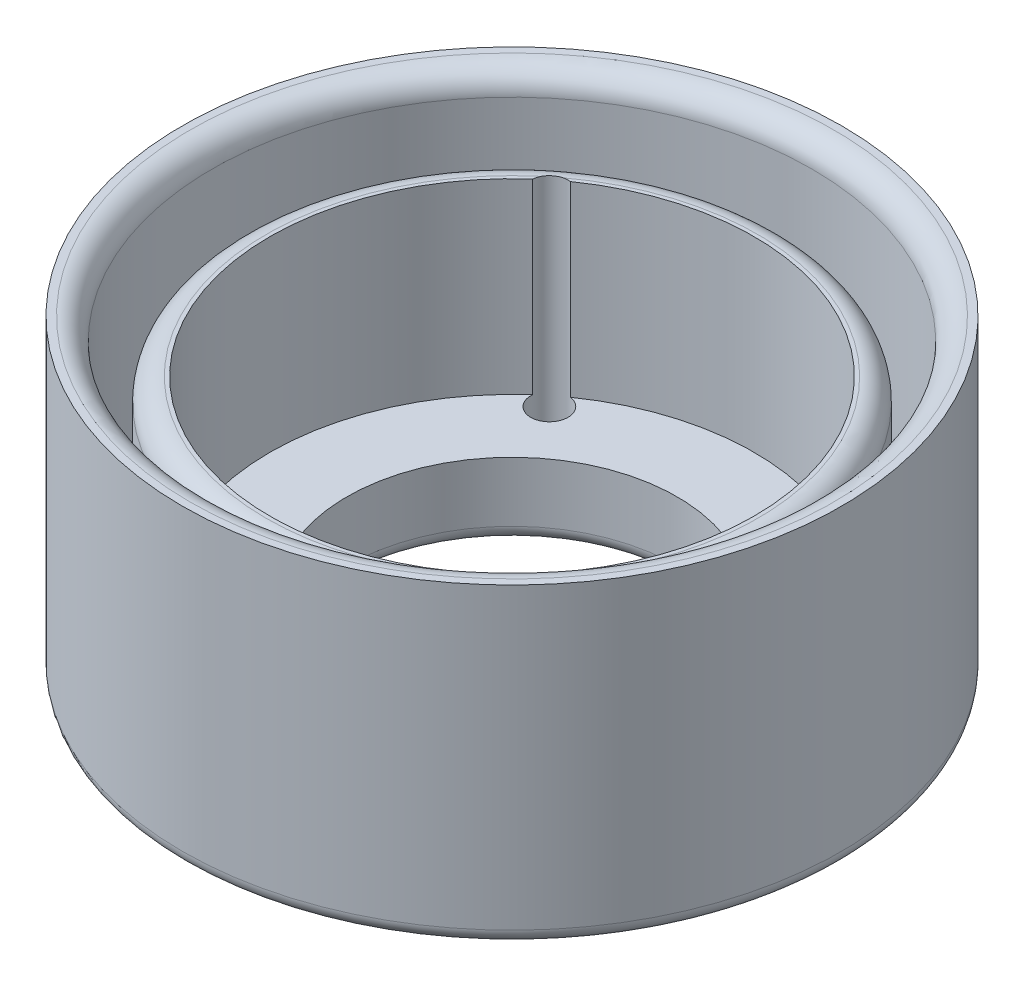
ISO-10303-21;
HEADER;
FILE_DESCRIPTION(('STEP AP214'),'2;1');
FILE_NAME('part.step','',(''),(''),'','','');
FILE_SCHEMA(('AUTOMOTIVE_DESIGN { 1 0 10303 214 1 1 1 1 }'));
ENDSEC;
DATA;
#1=APPLICATION_CONTEXT('core data for automotive mechanical design processes');
#2=APPLICATION_PROTOCOL_DEFINITION('international standard','automotive_design',2000,#1);
#3=PRODUCT_CONTEXT('',#1,'mechanical');
#4=PRODUCT('Part','Part','',(#3));
#5=PRODUCT_RELATED_PRODUCT_CATEGORY('part','',(#4));
#6=PRODUCT_DEFINITION_FORMATION('','',#4);
#7=PRODUCT_DEFINITION_CONTEXT('part definition',#1,'design');
#8=PRODUCT_DEFINITION('design','',#6,#7);
#9=PRODUCT_DEFINITION_SHAPE('','',#8);
#10=(LENGTH_UNIT() NAMED_UNIT(*) SI_UNIT(.MILLI.,.METRE.));
#11=(NAMED_UNIT(*) PLANE_ANGLE_UNIT() SI_UNIT($,.RADIAN.));
#12=(NAMED_UNIT(*) SI_UNIT($,.STERADIAN.) SOLID_ANGLE_UNIT());
#13=UNCERTAINTY_MEASURE_WITH_UNIT(LENGTH_MEASURE(1.E-05),#10,'distance_accuracy_value','');
#14=(GEOMETRIC_REPRESENTATION_CONTEXT(3) GLOBAL_UNCERTAINTY_ASSIGNED_CONTEXT((#13)) GLOBAL_UNIT_ASSIGNED_CONTEXT((#10,
#11,#12)) REPRESENTATION_CONTEXT('',''));
#15=CARTESIAN_POINT('',(0.,0.,0.));
#16=DIRECTION('',(0.,0.,1.));
#17=DIRECTION('',(1.,0.,0.));
#18=AXIS2_PLACEMENT_3D('',#15,#16,#17);
#19=CARTESIAN_POINT('',(0.,12.5,0.));
#20=DIRECTION('',(0.,1.,0.));
#21=DIRECTION('',(0.,0.,1.));
#22=AXIS2_PLACEMENT_3D('',#19,#20,#21);
#23=PLANE('',#22);
#24=CARTESIAN_POINT('',(-9.5,12.5,-12.));
#25=DIRECTION('',(0.,1.,0.));
#26=DIRECTION('',(0.,0.,1.));
#27=AXIS2_PLACEMENT_3D('',#24,#25,#26);
#28=CIRCLE('',#27,1.25);
#29=CARTESIAN_POINT('',(-10.743749989338,12.5,-12.1248437584407));
#30=VERTEX_POINT('',#29);
#31=CARTESIAN_POINT('',(-10.6134418037851,12.5,-12.5681085720035));
#32=VERTEX_POINT('',#31);
#33=EDGE_CURVE('E208',#30,#32,#28,.F.);
#34=ORIENTED_EDGE('',*,*,#33,.T.);
#35=CARTESIAN_POINT('',(0.,12.5,0.));
#36=DIRECTION('',(0.,1.,0.));
#37=DIRECTION('',(0.,0.,1.));
#38=AXIS2_PLACEMENT_3D('',#35,#36,#37);
#39=CIRCLE('',#38,16.45);
#40=CARTESIAN_POINT('',(9.79746534669518,12.5,13.2140899338663));
#41=VERTEX_POINT('',#40);
#42=EDGE_CURVE('E133',#32,#41,#39,.T.);
#43=ORIENTED_EDGE('',*,*,#42,.T.);
#44=CARTESIAN_POINT('',(9.50000000000001,12.5,12.));
#45=DIRECTION('',(0.,1.,0.));
#46=DIRECTION('',(0.,0.,1.));
#47=AXIS2_PLACEMENT_3D('',#44,#45,#46);
#48=CIRCLE('',#47,1.25);
#49=CARTESIAN_POINT('',(9.33612727853819,12.5,13.2392117378239));
#50=VERTEX_POINT('',#49);
#51=EDGE_CURVE('E252',#41,#50,#48,.F.);
#52=ORIENTED_EDGE('',*,*,#51,.T.);
#53=CARTESIAN_POINT('',(0.,12.5,0.));
#54=DIRECTION('',(0.,1.,0.));
#55=DIRECTION('',(0.,0.,1.));
#56=AXIS2_PLACEMENT_3D('',#53,#54,#55);
#57=CIRCLE('',#56,16.2);
#58=EDGE_CURVE('E210',#30,#50,#57,.T.);
#59=ORIENTED_EDGE('',*,*,#58,.F.);
#60=EDGE_LOOP('',(#34,#43,#52,#59));
#61=FACE_BOUND('',#60,.T.);
#62=ADVANCED_FACE('F37',(#61),#23,.T.);
#63=CARTESIAN_POINT('',(0.,12.5,0.));
#64=DIRECTION('',(0.,-1.,0.));
#65=DIRECTION('',(0.,0.,-1.));
#66=AXIS2_PLACEMENT_3D('',#63,#64,#65);
#67=CYLINDRICAL_SURFACE('',#66,16.2);
#68=DIRECTION('',(0.,-1.,0.));
#69=VECTOR('',#68,1.);
#70=CARTESIAN_POINT('',(-9.33612727853814,6.25,-13.239211737824));
#71=LINE('',#70,#69);
#72=CARTESIAN_POINT('',(-9.33612727853818,12.5,-13.2392117378239));
#73=VERTEX_POINT('',#72);
#74=CARTESIAN_POINT('',(-9.33612727853818,0.,-13.2392117378239));
#75=VERTEX_POINT('',#74);
#76=EDGE_CURVE('E95',#73,#75,#71,.T.);
#77=ORIENTED_EDGE('',*,*,#76,.T.);
#78=CARTESIAN_POINT('',(0.,0.,0.));
#79=DIRECTION('',(0.,1.,0.));
#80=DIRECTION('',(0.,0.,1.));
#81=AXIS2_PLACEMENT_3D('',#78,#79,#80);
#82=CIRCLE('',#81,16.2);
#83=CARTESIAN_POINT('',(10.743749989338,0.,12.1248437584407));
#84=VERTEX_POINT('',#83);
#85=EDGE_CURVE('E108',#75,#84,#82,.F.);
#86=ORIENTED_EDGE('',*,*,#85,.T.);
#87=DIRECTION('',(0.,-1.,0.));
#88=VECTOR('',#87,1.);
#89=CARTESIAN_POINT('',(10.7437499893381,6.25,12.1248437584407));
#90=LINE('',#89,#88);
#91=CARTESIAN_POINT('',(10.743749989338,12.5,12.1248437584407));
#92=VERTEX_POINT('',#91);
#93=EDGE_CURVE('E250',#84,#92,#90,.F.);
#94=ORIENTED_EDGE('',*,*,#93,.T.);
#95=EDGE_CURVE('E111',#92,#73,#57,.T.);
#96=ORIENTED_EDGE('',*,*,#95,.T.);
#97=EDGE_LOOP('',(#77,#86,#94,#96));
#98=FACE_BOUND('',#97,.T.);
#99=ADVANCED_FACE('F106',(#98),#67,.F.);
#100=CARTESIAN_POINT('',(0.,16.,0.));
#101=DIRECTION('',(0.,-1.,0.));
#102=DIRECTION('',(0.,0.,-1.));
#103=AXIS2_PLACEMENT_3D('',#100,#101,#102);
#104=CYLINDRICAL_SURFACE('',#103,20.05);
#105=CARTESIAN_POINT('',(0.,14.5,0.));
#106=DIRECTION('',(0.,1.,0.));
#107=DIRECTION('',(0.,0.,1.));
#108=AXIS2_PLACEMENT_3D('',#105,#106,#107);
#109=CIRCLE('',#108,20.05);
#110=CARTESIAN_POINT('',(0.,14.5,20.05));
#111=VERTEX_POINT('',#110);
#112=EDGE_CURVE('E217',#111,#111,#109,.T.);
#113=ORIENTED_EDGE('',*,*,#112,.T.);
#114=EDGE_LOOP('',(#113));
#115=FACE_BOUND('',#114,.T.);
#116=CARTESIAN_POINT('',(0.,0.,0.));
#117=DIRECTION('',(0.,1.,0.));
#118=DIRECTION('',(0.,0.,1.));
#119=AXIS2_PLACEMENT_3D('',#116,#117,#118);
#120=CIRCLE('',#119,20.05);
#121=CARTESIAN_POINT('',(0.,0.,20.05));
#122=VERTEX_POINT('',#121);
#123=EDGE_CURVE('E122',#122,#122,#120,.T.);
#124=ORIENTED_EDGE('',*,*,#123,.F.);
#125=EDGE_LOOP('',(#124));
#126=FACE_BOUND('',#125,.T.);
#127=ADVANCED_FACE('F186',(#115,#126),#104,.F.);
#128=CARTESIAN_POINT('',(0.,16.,0.));
#129=DIRECTION('',(0.,-1.,0.));
#130=DIRECTION('',(0.,0.,-1.));
#131=AXIS2_PLACEMENT_3D('',#128,#129,#130);
#132=CYLINDRICAL_SURFACE('',#131,22.05);
#133=CARTESIAN_POINT('',(0.,-4.,0.));
#134=DIRECTION('',(0.,1.,0.));
#135=DIRECTION('',(0.,0.,1.));
#136=AXIS2_PLACEMENT_3D('',#133,#134,#135);
#137=CIRCLE('',#136,22.05);
#138=CARTESIAN_POINT('',(0.,-4.,22.05));
#139=VERTEX_POINT('',#138);
#140=EDGE_CURVE('E45',#139,#139,#137,.T.);
#141=ORIENTED_EDGE('',*,*,#140,.T.);
#142=EDGE_LOOP('',(#141));
#143=FACE_BOUND('',#142,.T.);
#144=CARTESIAN_POINT('',(0.,16.,0.));
#145=DIRECTION('',(0.,1.,0.));
#146=DIRECTION('',(0.,0.,1.));
#147=AXIS2_PLACEMENT_3D('',#144,#145,#146);
#148=CIRCLE('',#147,22.05);
#149=CARTESIAN_POINT('',(0.,16.,22.05));
#150=VERTEX_POINT('',#149);
#151=EDGE_CURVE('E118',#150,#150,#148,.T.);
#152=ORIENTED_EDGE('',*,*,#151,.F.);
#153=EDGE_LOOP('',(#152));
#154=FACE_BOUND('',#153,.T.);
#155=ADVANCED_FACE('F182',(#143,#154),#132,.T.);
#156=CARTESIAN_POINT('',(0.,16.,0.));
#157=DIRECTION('',(0.,1.,0.));
#158=DIRECTION('',(0.,0.,1.));
#159=AXIS2_PLACEMENT_3D('',#156,#157,#158);
#160=PLANE('',#159);
#161=CARTESIAN_POINT('',(0.,16.,0.));
#162=DIRECTION('',(0.,1.,0.));
#163=DIRECTION('',(0.,0.,1.));
#164=AXIS2_PLACEMENT_3D('',#161,#162,#163);
#165=CIRCLE('',#164,21.55);
#166=CARTESIAN_POINT('',(0.,16.,21.55));
#167=VERTEX_POINT('',#166);
#168=EDGE_CURVE('E220',#167,#167,#165,.F.);
#169=ORIENTED_EDGE('',*,*,#168,.T.);
#170=EDGE_LOOP('',(#169));
#171=FACE_BOUND('',#170,.T.);
#172=ORIENTED_EDGE('',*,*,#151,.T.);
#173=EDGE_LOOP('',(#172));
#174=FACE_BOUND('',#173,.T.);
#175=ADVANCED_FACE('F175',(#171,#174),#160,.T.);
#176=CARTESIAN_POINT('',(0.,-5.,0.));
#177=DIRECTION('',(0.,1.,0.));
#178=DIRECTION('',(0.,0.,1.));
#179=AXIS2_PLACEMENT_3D('',#176,#177,#178);
#180=PLANE('',#179);
#181=CARTESIAN_POINT('',(0.,-5.,0.));
#182=DIRECTION('',(0.,1.,0.));
#183=DIRECTION('',(0.,0.,1.));
#184=AXIS2_PLACEMENT_3D('',#181,#182,#183);
#185=CIRCLE('',#184,21.05);
#186=CARTESIAN_POINT('',(0.,-5.,21.05));
#187=VERTEX_POINT('',#186);
#188=EDGE_CURVE('E11',#187,#187,#185,.F.);
#189=ORIENTED_EDGE('',*,*,#188,.T.);
#190=EDGE_LOOP('',(#189));
#191=FACE_BOUND('',#190,.T.);
#192=CARTESIAN_POINT('',(0.,-5.,0.));
#193=DIRECTION('',(0.,1.,0.));
#194=DIRECTION('',(0.,0.,1.));
#195=AXIS2_PLACEMENT_3D('',#192,#193,#194);
#196=CIRCLE('',#195,12.05);
#197=CARTESIAN_POINT('',(0.,-5.,12.05));
#198=VERTEX_POINT('',#197);
#199=EDGE_CURVE('E128',#198,#198,#196,.T.);
#200=ORIENTED_EDGE('',*,*,#199,.T.);
#201=EDGE_LOOP('',(#200));
#202=FACE_BOUND('',#201,.T.);
#203=CARTESIAN_POINT('',(-9.5,-5.,-12.));
#204=DIRECTION('',(0.,-1.,0.));
#205=DIRECTION('',(0.,0.,-1.));
#206=AXIS2_PLACEMENT_3D('',#203,#204,#205);
#207=CIRCLE('',#206,1.25);
#208=CARTESIAN_POINT('',(-9.5,-5.,-13.25));
#209=VERTEX_POINT('',#208);
#210=EDGE_CURVE('E103',#209,#209,#207,.T.);
#211=ORIENTED_EDGE('',*,*,#210,.F.);
#212=EDGE_LOOP('',(#211));
#213=FACE_BOUND('',#212,.T.);
#214=CARTESIAN_POINT('',(9.50000000000001,-5.,12.));
#215=DIRECTION('',(0.,-1.,0.));
#216=DIRECTION('',(0.,0.,-1.));
#217=AXIS2_PLACEMENT_3D('',#214,#215,#216);
#218=CIRCLE('',#217,1.25);
#219=CARTESIAN_POINT('',(9.50000000000001,-5.,10.75));
#220=VERTEX_POINT('',#219);
#221=EDGE_CURVE('E211',#220,#220,#218,.T.);
#222=ORIENTED_EDGE('',*,*,#221,.F.);
#223=EDGE_LOOP('',(#222));
#224=FACE_BOUND('',#223,.T.);
#225=ADVANCED_FACE('F172',(#191,#202,#213,#224),#180,.F.);
#226=CARTESIAN_POINT('',(0.,0.,0.));
#227=DIRECTION('',(0.,1.,0.));
#228=DIRECTION('',(0.,0.,1.));
#229=AXIS2_PLACEMENT_3D('',#226,#227,#228);
#230=PLANE('',#229);
#231=CARTESIAN_POINT('',(0.,0.,0.));
#232=DIRECTION('',(0.,1.,0.));
#233=DIRECTION('',(0.,0.,1.));
#234=AXIS2_PLACEMENT_3D('',#231,#232,#233);
#235=CIRCLE('',#234,17.95);
#236=CARTESIAN_POINT('',(0.,0.,17.95));
#237=VERTEX_POINT('',#236);
#238=EDGE_CURVE('E258',#237,#237,#235,.T.);
#239=ORIENTED_EDGE('',*,*,#238,.F.);
#240=EDGE_LOOP('',(#239));
#241=FACE_BOUND('',#240,.T.);
#242=ORIENTED_EDGE('',*,*,#123,.T.);
#243=EDGE_LOOP('',(#242));
#244=FACE_BOUND('',#243,.T.);
#245=ADVANCED_FACE('F170',(#241,#244),#230,.T.);
#246=DIRECTION('',(0.,-1.,0.));
#247=VECTOR('',#246,1.);
#248=CARTESIAN_POINT('',(-10.743749989338,6.25,-12.1248437584407));
#249=LINE('',#248,#247);
#250=CARTESIAN_POINT('',(-10.743749989338,0.,-12.1248437584407));
#251=VERTEX_POINT('',#250);
#252=EDGE_CURVE('E98',#251,#30,#249,.F.);
#253=ORIENTED_EDGE('',*,*,#252,.T.);
#254=ORIENTED_EDGE('',*,*,#58,.T.);
#255=DIRECTION('',(0.,-1.,0.));
#256=VECTOR('',#255,1.);
#257=CARTESIAN_POINT('',(9.33612727853816,6.25,13.239211737824));
#258=LINE('',#257,#256);
#259=CARTESIAN_POINT('',(9.33612727853819,0.,13.2392117378239));
#260=VERTEX_POINT('',#259);
#261=EDGE_CURVE('E244',#50,#260,#258,.T.);
#262=ORIENTED_EDGE('',*,*,#261,.T.);
#263=EDGE_CURVE('E117',#260,#251,#82,.F.);
#264=ORIENTED_EDGE('',*,*,#263,.T.);
#265=EDGE_LOOP('',(#253,#254,#262,#264));
#266=FACE_BOUND('',#265,.T.);
#267=ADVANCED_FACE('F166',(#266),#67,.F.);
#268=CARTESIAN_POINT('',(0.,12.5,0.));
#269=DIRECTION('',(0.,-1.,0.));
#270=DIRECTION('',(0.,0.,-1.));
#271=AXIS2_PLACEMENT_3D('',#268,#269,#270);
#272=CYLINDRICAL_SURFACE('',#271,17.95);
#273=CARTESIAN_POINT('',(0.,11.,0.));
#274=DIRECTION('',(0.,1.,0.));
#275=DIRECTION('',(0.,0.,1.));
#276=AXIS2_PLACEMENT_3D('',#273,#274,#275);
#277=CIRCLE('',#276,17.95);
#278=CARTESIAN_POINT('',(0.,11.,17.95));
#279=VERTEX_POINT('',#278);
#280=EDGE_CURVE('E215',#279,#279,#277,.F.);
#281=ORIENTED_EDGE('',*,*,#280,.T.);
#282=EDGE_LOOP('',(#281));
#283=FACE_BOUND('',#282,.T.);
#284=ORIENTED_EDGE('',*,*,#238,.T.);
#285=EDGE_LOOP('',(#284));
#286=FACE_BOUND('',#285,.T.);
#287=ADVANCED_FACE('F162',(#283,#286),#272,.T.);
#288=CARTESIAN_POINT('',(10.6134418037851,12.5,12.5681085720035));
#289=VERTEX_POINT('',#288);
#290=EDGE_CURVE('E253',#92,#289,#48,.F.);
#291=ORIENTED_EDGE('',*,*,#290,.T.);
#292=CARTESIAN_POINT('',(0.,12.5,0.));
#293=DIRECTION('',(0.,1.,0.));
#294=DIRECTION('',(0.,0.,1.));
#295=AXIS2_PLACEMENT_3D('',#292,#293,#294);
#296=CIRCLE('',#295,16.45);
#297=CARTESIAN_POINT('',(-9.79746534669517,12.5,-13.2140899338663));
#298=VERTEX_POINT('',#297);
#299=EDGE_CURVE('E131',#289,#298,#296,.T.);
#300=ORIENTED_EDGE('',*,*,#299,.T.);
#301=EDGE_CURVE('E212',#298,#73,#28,.F.);
#302=ORIENTED_EDGE('',*,*,#301,.T.);
#303=ORIENTED_EDGE('',*,*,#95,.F.);
#304=EDGE_LOOP('',(#291,#300,#302,#303));
#305=FACE_BOUND('',#304,.T.);
#306=ADVANCED_FACE('F159',(#305),#23,.T.);
#307=CARTESIAN_POINT('',(-9.5,0.,-12.));
#308=DIRECTION('',(0.,1.,0.));
#309=DIRECTION('',(0.,0.,1.));
#310=AXIS2_PLACEMENT_3D('',#307,#308,#309);
#311=CIRCLE('',#310,1.25);
#312=EDGE_CURVE('E90',#75,#251,#311,.F.);
#313=ORIENTED_EDGE('',*,*,#312,.T.);
#314=ORIENTED_EDGE('',*,*,#263,.F.);
#315=CARTESIAN_POINT('',(9.50000000000001,0.,12.));
#316=DIRECTION('',(0.,1.,0.));
#317=DIRECTION('',(0.,0.,1.));
#318=AXIS2_PLACEMENT_3D('',#315,#316,#317);
#319=CIRCLE('',#318,1.25);
#320=EDGE_CURVE('E116',#260,#84,#319,.F.);
#321=ORIENTED_EDGE('',*,*,#320,.T.);
#322=ORIENTED_EDGE('',*,*,#85,.F.);
#323=EDGE_LOOP('',(#313,#314,#321,#322));
#324=FACE_BOUND('',#323,.T.);
#325=CARTESIAN_POINT('',(0.,0.,0.));
#326=DIRECTION('',(0.,1.,0.));
#327=DIRECTION('',(0.,0.,1.));
#328=AXIS2_PLACEMENT_3D('',#325,#326,#327);
#329=CIRCLE('',#328,11.05);
#330=CARTESIAN_POINT('',(0.,0.,11.05));
#331=VERTEX_POINT('',#330);
#332=EDGE_CURVE('E255',#331,#331,#329,.F.);
#333=ORIENTED_EDGE('',*,*,#332,.T.);
#334=EDGE_LOOP('',(#333));
#335=FACE_BOUND('',#334,.T.);
#336=ADVANCED_FACE('F114',(#324,#335),#230,.T.);
#337=CARTESIAN_POINT('',(0.,16.001,0.));
#338=DIRECTION('',(0.,-1.,0.));
#339=DIRECTION('',(0.,0.,-1.));
#340=AXIS2_PLACEMENT_3D('',#337,#338,#339);
#341=CYLINDRICAL_SURFACE('',#340,11.05);
#342=CARTESIAN_POINT('',(0.,-4.,0.));
#343=DIRECTION('',(0.,1.,0.));
#344=DIRECTION('',(0.,0.,1.));
#345=AXIS2_PLACEMENT_3D('',#342,#343,#344);
#346=CIRCLE('',#345,11.05);
#347=CARTESIAN_POINT('',(0.,-4.,11.05));
#348=VERTEX_POINT('',#347);
#349=EDGE_CURVE('E120',#348,#348,#346,.F.);
#350=ORIENTED_EDGE('',*,*,#349,.T.);
#351=EDGE_LOOP('',(#350));
#352=FACE_BOUND('',#351,.T.);
#353=ORIENTED_EDGE('',*,*,#332,.F.);
#354=EDGE_LOOP('',(#353));
#355=FACE_BOUND('',#354,.T.);
#356=ADVANCED_FACE('F154',(#352,#355),#341,.F.);
#357=CARTESIAN_POINT('',(9.50000000000001,16.001,12.));
#358=DIRECTION('',(0.,-1.,0.));
#359=DIRECTION('',(0.,0.,-1.));
#360=AXIS2_PLACEMENT_3D('',#357,#358,#359);
#361=CYLINDRICAL_SURFACE('',#360,1.25);
#362=ORIENTED_EDGE('',*,*,#51,.F.);
#363=CARTESIAN_POINT('',(9.79746534669518,12.5,13.2140899338663));
#364=CARTESIAN_POINT('',(9.83159877535244,12.4999955857231,13.2057263986661));
#365=CARTESIAN_POINT('',(9.86536169705997,12.4998154547105,13.1959276805059));
#366=CARTESIAN_POINT('',(9.93194134990984,12.4992730166514,13.1735253895522));
#367=CARTESIAN_POINT('',(9.96475810783621,12.4989107147671,13.1609218962447));
#368=CARTESIAN_POINT('',(10.0614116659808,12.4978052324506,13.1190331438967));
#369=CARTESIAN_POINT('',(10.1235295251341,12.4970427032076,13.085650479651));
#370=CARTESIAN_POINT('',(10.2412962000051,12.496239685228,13.0089260305306));
#371=CARTESIAN_POINT('',(10.2969399594489,12.4961997571318,12.9655765391552));
#372=CARTESIAN_POINT('',(10.40011567983,12.4968771766773,12.8701800315109));
#373=CARTESIAN_POINT('',(10.4476576786174,12.4975935792068,12.8181439383648));
#374=CARTESIAN_POINT('',(10.5139143054173,12.498740221059,12.7320928785336));
#375=CARTESIAN_POINT('',(10.5359415851097,12.4991533324704,12.7005723574991));
#376=CARTESIAN_POINT('',(10.5769801344743,12.4997795763179,12.6356768001268));
#377=CARTESIAN_POINT('',(10.5959949867349,12.4999929478046,12.6023040314025));
#378=CARTESIAN_POINT('',(10.6134418037851,12.5,12.5681085720035));
#379=B_SPLINE_CURVE_WITH_KNOTS('',3,(#363,#364,#365,#366,#367,#368,#369,#370,#371,#372,#373,
#374,#375,#376,#377,#378),.UNSPECIFIED.,.F.,.F.,(4,2,2,2,2,2,2,4),(0.,0.10536206176478,
0.210721138001865,0.421202047950026,0.631846255506518,0.842227552906535,0.957452648632279,
1.07253966495443),.UNSPECIFIED.);
#380=EDGE_CURVE('E52',#41,#289,#379,.T.);
#381=ORIENTED_EDGE('',*,*,#380,.T.);
#382=ORIENTED_EDGE('',*,*,#290,.F.);
#383=ORIENTED_EDGE('',*,*,#93,.F.);
#384=ORIENTED_EDGE('',*,*,#320,.F.);
#385=ORIENTED_EDGE('',*,*,#261,.F.);
#386=EDGE_LOOP('',(#362,#381,#382,#383,#384,#385));
#387=FACE_BOUND('',#386,.T.);
#388=ORIENTED_EDGE('',*,*,#221,.T.);
#389=EDGE_LOOP('',(#388));
#390=FACE_BOUND('',#389,.T.);
#391=ADVANCED_FACE('F150',(#387,#390),#361,.F.);
#392=CARTESIAN_POINT('',(-9.5,16.001,-12.));
#393=DIRECTION('',(0.,-1.,0.));
#394=DIRECTION('',(0.,0.,-1.));
#395=AXIS2_PLACEMENT_3D('',#392,#393,#394);
#396=CYLINDRICAL_SURFACE('',#395,1.25);
#397=ORIENTED_EDGE('',*,*,#301,.F.);
#398=CARTESIAN_POINT('',(-9.79746534669517,12.5,-13.2140899338663));
#399=CARTESIAN_POINT('',(-9.83159877535243,12.4999955857231,-13.2057263986661));
#400=CARTESIAN_POINT('',(-9.86536169705997,12.4998154547105,-13.1959276805059));
#401=CARTESIAN_POINT('',(-9.93194134990983,12.4992730166514,-13.1735253895522));
#402=CARTESIAN_POINT('',(-9.9647581078362,12.4989107147671,-13.1609218962447));
#403=CARTESIAN_POINT('',(-10.0614116659808,12.4978052324506,-13.1190331438967));
#404=CARTESIAN_POINT('',(-10.1235295251341,12.4970427032076,-13.085650479651));
#405=CARTESIAN_POINT('',(-10.2412962000051,12.496239685228,-13.0089260305306));
#406=CARTESIAN_POINT('',(-10.2969399594489,12.4961997571318,-12.9655765391552));
#407=CARTESIAN_POINT('',(-10.4001156798299,12.4968771766773,-12.870180031511));
#408=CARTESIAN_POINT('',(-10.4476576786174,12.4975935792068,-12.8181439383648));
#409=CARTESIAN_POINT('',(-10.5139143054173,12.498740221059,-12.7320928785336));
#410=CARTESIAN_POINT('',(-10.5359415851097,12.4991533324704,-12.7005723574991));
#411=CARTESIAN_POINT('',(-10.5769801344743,12.4997795763179,-12.6356768001269));
#412=CARTESIAN_POINT('',(-10.5959949867349,12.4999929478046,-12.6023040314025));
#413=CARTESIAN_POINT('',(-10.6134418037851,12.5,-12.5681085720035));
#414=B_SPLINE_CURVE_WITH_KNOTS('',3,(#398,#399,#400,#401,#402,#403,#404,#405,#406,#407,#408,
#409,#410,#411,#412,#413),.UNSPECIFIED.,.F.,.F.,(4,2,2,2,2,2,2,4),(0.,0.105362061764782,
0.210721138001865,0.421202047950024,0.631846255506515,0.842227552906533,0.957452648632271,
1.07253966495442),.UNSPECIFIED.);
#415=EDGE_CURVE('E141',#298,#32,#414,.T.);
#416=ORIENTED_EDGE('',*,*,#415,.T.);
#417=ORIENTED_EDGE('',*,*,#33,.F.);
#418=ORIENTED_EDGE('',*,*,#252,.F.);
#419=ORIENTED_EDGE('',*,*,#312,.F.);
#420=ORIENTED_EDGE('',*,*,#76,.F.);
#421=EDGE_LOOP('',(#397,#416,#417,#418,#419,#420));
#422=FACE_BOUND('',#421,.T.);
#423=ORIENTED_EDGE('',*,*,#210,.T.);
#424=EDGE_LOOP('',(#423));
#425=FACE_BOUND('',#424,.T.);
#426=ADVANCED_FACE('F93',(#422,#425),#396,.F.);
#427=CARTESIAN_POINT('',(0.,-4.,0.));
#428=DIRECTION('',(0.,1.,0.));
#429=DIRECTION('',(0.,0.,1.));
#430=AXIS2_PLACEMENT_3D('',#427,#428,#429);
#431=TOROIDAL_SURFACE('',#430,12.05,1.);
#432=ORIENTED_EDGE('',*,*,#199,.F.);
#433=EDGE_LOOP('',(#432));
#434=FACE_BOUND('',#433,.T.);
#435=ORIENTED_EDGE('',*,*,#349,.F.);
#436=EDGE_LOOP('',(#435));
#437=FACE_BOUND('',#436,.T.);
#438=ADVANCED_FACE('F190',(#434,#437),#431,.T.);
#439=CARTESIAN_POINT('',(0.,11.,0.));
#440=DIRECTION('',(0.,1.,0.));
#441=DIRECTION('',(0.,0.,1.));
#442=AXIS2_PLACEMENT_3D('',#439,#440,#441);
#443=TOROIDAL_SURFACE('',#442,16.45,1.5);
#444=ORIENTED_EDGE('',*,*,#280,.F.);
#445=EDGE_LOOP('',(#444));
#446=FACE_BOUND('',#445,.T.);
#447=ORIENTED_EDGE('',*,*,#380,.F.);
#448=ORIENTED_EDGE('',*,*,#42,.F.);
#449=ORIENTED_EDGE('',*,*,#415,.F.);
#450=ORIENTED_EDGE('',*,*,#299,.F.);
#451=EDGE_LOOP('',(#447,#448,#449,#450));
#452=FACE_BOUND('',#451,.T.);
#453=ADVANCED_FACE('F147',(#446,#452),#443,.T.);
#454=CARTESIAN_POINT('',(0.,14.5,0.));
#455=DIRECTION('',(0.,1.,0.));
#456=DIRECTION('',(0.,0.,1.));
#457=AXIS2_PLACEMENT_3D('',#454,#455,#456);
#458=TOROIDAL_SURFACE('',#457,21.55,1.5);
#459=ORIENTED_EDGE('',*,*,#168,.F.);
#460=EDGE_LOOP('',(#459));
#461=FACE_BOUND('',#460,.T.);
#462=ORIENTED_EDGE('',*,*,#112,.F.);
#463=EDGE_LOOP('',(#462));
#464=FACE_BOUND('',#463,.T.);
#465=ADVANCED_FACE('F197',(#461,#464),#458,.T.);
#466=CARTESIAN_POINT('',(0.,-4.,0.));
#467=DIRECTION('',(0.,1.,0.));
#468=DIRECTION('',(0.,0.,1.));
#469=AXIS2_PLACEMENT_3D('',#466,#467,#468);
#470=TOROIDAL_SURFACE('',#469,21.05,1.);
#471=ORIENTED_EDGE('',*,*,#188,.F.);
#472=EDGE_LOOP('',(#471));
#473=FACE_BOUND('',#472,.T.);
#474=ORIENTED_EDGE('',*,*,#140,.F.);
#475=EDGE_LOOP('',(#474));
#476=FACE_BOUND('',#475,.T.);
#477=ADVANCED_FACE('F39',(#473,#476),#470,.T.);
#478=CLOSED_SHELL('',(#62,#99,#127,#155,#175,#225,#245,#267,#287,#306,#336,#356,#391,#426,#438,
#453,#465,#477));
#479=MANIFOLD_SOLID_BREP('B2',#478);
#480=ADVANCED_BREP_SHAPE_REPRESENTATION('',(#18,#479),#14);
#481=SHAPE_DEFINITION_REPRESENTATION(#9,#480);
ENDSEC;
END-ISO-10303-21;
